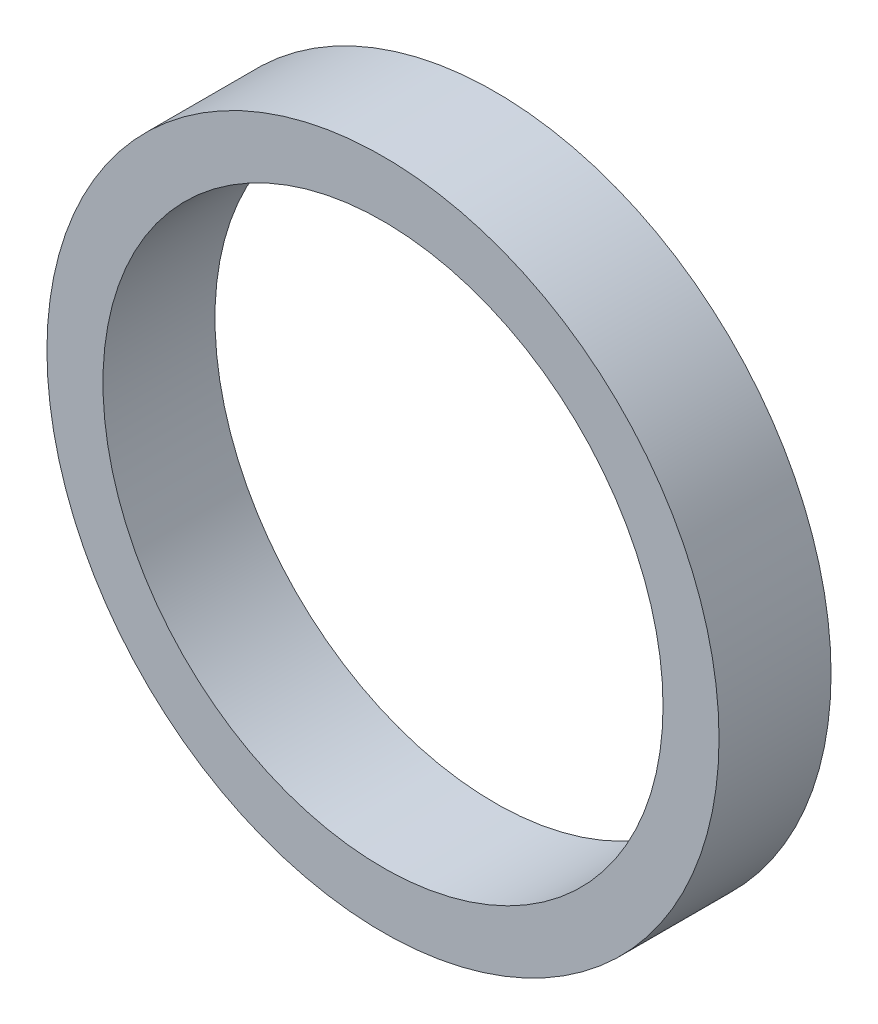
ISO-10303-21;
HEADER;
FILE_DESCRIPTION(('STEP AP214'),'2;1');
FILE_NAME('part.step','',(''),(''),'','','');
FILE_SCHEMA(('AUTOMOTIVE_DESIGN { 1 0 10303 214 1 1 1 1 }'));
ENDSEC;
DATA;
#1=APPLICATION_CONTEXT('core data for automotive mechanical design processes');
#2=APPLICATION_PROTOCOL_DEFINITION('international standard','automotive_design',2000,#1);
#3=PRODUCT_CONTEXT('',#1,'mechanical');
#4=PRODUCT('Part','Part','',(#3));
#5=PRODUCT_RELATED_PRODUCT_CATEGORY('part','',(#4));
#6=PRODUCT_DEFINITION_FORMATION('','',#4);
#7=PRODUCT_DEFINITION_CONTEXT('part definition',#1,'design');
#8=PRODUCT_DEFINITION('design','',#6,#7);
#9=PRODUCT_DEFINITION_SHAPE('','',#8);
#10=(LENGTH_UNIT() NAMED_UNIT(*) SI_UNIT(.MILLI.,.METRE.));
#11=(NAMED_UNIT(*) PLANE_ANGLE_UNIT() SI_UNIT($,.RADIAN.));
#12=(NAMED_UNIT(*) SI_UNIT($,.STERADIAN.) SOLID_ANGLE_UNIT());
#13=UNCERTAINTY_MEASURE_WITH_UNIT(LENGTH_MEASURE(1.E-05),#10,'distance_accuracy_value','');
#14=(GEOMETRIC_REPRESENTATION_CONTEXT(3) GLOBAL_UNCERTAINTY_ASSIGNED_CONTEXT((#13)) GLOBAL_UNIT_ASSIGNED_CONTEXT((#10,
#11,#12)) REPRESENTATION_CONTEXT('',''));
#15=CARTESIAN_POINT('',(0.,0.,0.));
#16=DIRECTION('',(0.,0.,1.));
#17=DIRECTION('',(1.,0.,0.));
#18=AXIS2_PLACEMENT_3D('',#15,#16,#17);
#19=CARTESIAN_POINT('',(0.,0.,2.));
#20=DIRECTION('',(0.,0.,1.));
#21=DIRECTION('',(1.,0.,0.));
#22=AXIS2_PLACEMENT_3D('',#19,#20,#21);
#23=PLANE('',#22);
#24=CARTESIAN_POINT('',(0.,0.,2.));
#25=DIRECTION('',(0.,0.,1.));
#26=DIRECTION('',(1.,0.,0.));
#27=AXIS2_PLACEMENT_3D('',#24,#25,#26);
#28=CIRCLE('',#27,6.);
#29=CARTESIAN_POINT('',(6.,0.,2.));
#30=VERTEX_POINT('',#29);
#31=EDGE_CURVE('E11',#30,#30,#28,.T.);
#32=ORIENTED_EDGE('',*,*,#31,.T.);
#33=EDGE_LOOP('',(#32));
#34=FACE_BOUND('',#33,.T.);
#35=CARTESIAN_POINT('',(0.,0.,2.));
#36=DIRECTION('',(0.,0.,1.));
#37=DIRECTION('',(1.,0.,0.));
#38=AXIS2_PLACEMENT_3D('',#35,#36,#37);
#39=CIRCLE('',#38,5.);
#40=CARTESIAN_POINT('',(5.,0.,2.));
#41=VERTEX_POINT('',#40);
#42=EDGE_CURVE('E54',#41,#41,#39,.T.);
#43=ORIENTED_EDGE('',*,*,#42,.F.);
#44=EDGE_LOOP('',(#43));
#45=FACE_BOUND('',#44,.T.);
#46=ADVANCED_FACE('F43',(#34,#45),#23,.T.);
#47=CARTESIAN_POINT('',(0.,0.,0.));
#48=DIRECTION('',(0.,0.,1.));
#49=DIRECTION('',(1.,0.,0.));
#50=AXIS2_PLACEMENT_3D('',#47,#48,#49);
#51=PLANE('',#50);
#52=CARTESIAN_POINT('',(0.,0.,0.));
#53=DIRECTION('',(0.,0.,1.));
#54=DIRECTION('',(1.,0.,0.));
#55=AXIS2_PLACEMENT_3D('',#52,#53,#54);
#56=CIRCLE('',#55,6.);
#57=CARTESIAN_POINT('',(6.,0.,0.));
#58=VERTEX_POINT('',#57);
#59=EDGE_CURVE('E47',#58,#58,#56,.T.);
#60=ORIENTED_EDGE('',*,*,#59,.F.);
#61=EDGE_LOOP('',(#60));
#62=FACE_BOUND('',#61,.T.);
#63=CARTESIAN_POINT('',(0.,0.,0.));
#64=DIRECTION('',(0.,0.,1.));
#65=DIRECTION('',(1.,0.,0.));
#66=AXIS2_PLACEMENT_3D('',#63,#64,#65);
#67=CIRCLE('',#66,5.);
#68=CARTESIAN_POINT('',(5.,0.,0.));
#69=VERTEX_POINT('',#68);
#70=EDGE_CURVE('E56',#69,#69,#67,.T.);
#71=ORIENTED_EDGE('',*,*,#70,.T.);
#72=EDGE_LOOP('',(#71));
#73=FACE_BOUND('',#72,.T.);
#74=ADVANCED_FACE('F66',(#62,#73),#51,.F.);
#75=CARTESIAN_POINT('',(0.,0.,2.));
#76=DIRECTION('',(0.,0.,-1.));
#77=DIRECTION('',(-1.,0.,0.));
#78=AXIS2_PLACEMENT_3D('',#75,#76,#77);
#79=CYLINDRICAL_SURFACE('',#78,6.);
#80=ORIENTED_EDGE('',*,*,#31,.F.);
#81=EDGE_LOOP('',(#80));
#82=FACE_BOUND('',#81,.T.);
#83=ORIENTED_EDGE('',*,*,#59,.T.);
#84=EDGE_LOOP('',(#83));
#85=FACE_BOUND('',#84,.T.);
#86=ADVANCED_FACE('F45',(#82,#85),#79,.T.);
#87=CARTESIAN_POINT('',(0.,0.,2.));
#88=DIRECTION('',(0.,0.,-1.));
#89=DIRECTION('',(-1.,0.,0.));
#90=AXIS2_PLACEMENT_3D('',#87,#88,#89);
#91=CYLINDRICAL_SURFACE('',#90,5.);
#92=ORIENTED_EDGE('',*,*,#42,.T.);
#93=EDGE_LOOP('',(#92));
#94=FACE_BOUND('',#93,.T.);
#95=ORIENTED_EDGE('',*,*,#70,.F.);
#96=EDGE_LOOP('',(#95));
#97=FACE_BOUND('',#96,.T.);
#98=ADVANCED_FACE('F62',(#94,#97),#91,.F.);
#99=CLOSED_SHELL('',(#46,#74,#86,#98));
#100=MANIFOLD_SOLID_BREP('B2',#99);
#101=ADVANCED_BREP_SHAPE_REPRESENTATION('',(#18,#100),#14);
#102=SHAPE_DEFINITION_REPRESENTATION(#9,#101);
ENDSEC;
END-ISO-10303-21;
